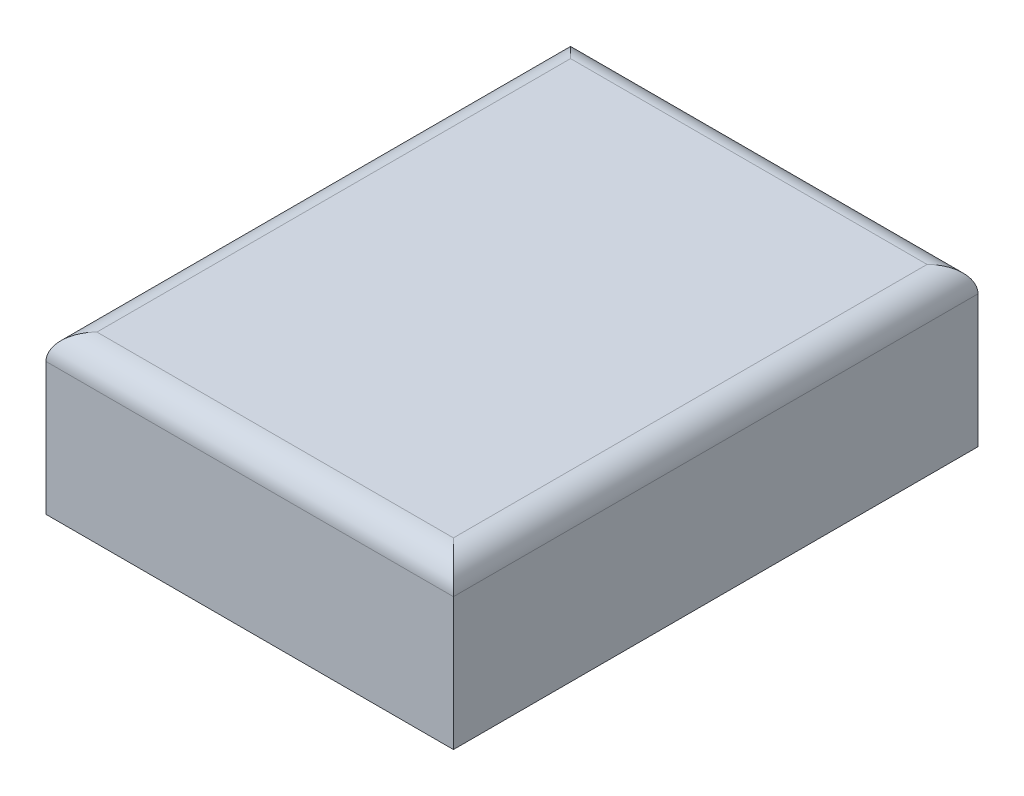
ISO-10303-21;
HEADER;
FILE_DESCRIPTION(('STEP AP214'),'2;1');
FILE_NAME('part.step','',(''),(''),'','','');
FILE_SCHEMA(('AUTOMOTIVE_DESIGN { 1 0 10303 214 1 1 1 1 }'));
ENDSEC;
DATA;
#1=APPLICATION_CONTEXT('core data for automotive mechanical design processes');
#2=APPLICATION_PROTOCOL_DEFINITION('international standard','automotive_design',2000,#1);
#3=PRODUCT_CONTEXT('',#1,'mechanical');
#4=PRODUCT('Part','Part','',(#3));
#5=PRODUCT_RELATED_PRODUCT_CATEGORY('part','',(#4));
#6=PRODUCT_DEFINITION_FORMATION('','',#4);
#7=PRODUCT_DEFINITION_CONTEXT('part definition',#1,'design');
#8=PRODUCT_DEFINITION('design','',#6,#7);
#9=PRODUCT_DEFINITION_SHAPE('','',#8);
#10=(LENGTH_UNIT() NAMED_UNIT(*) SI_UNIT(.MILLI.,.METRE.));
#11=(NAMED_UNIT(*) PLANE_ANGLE_UNIT() SI_UNIT($,.RADIAN.));
#12=(NAMED_UNIT(*) SI_UNIT($,.STERADIAN.) SOLID_ANGLE_UNIT());
#13=UNCERTAINTY_MEASURE_WITH_UNIT(LENGTH_MEASURE(1.E-05),#10,'distance_accuracy_value','');
#14=(GEOMETRIC_REPRESENTATION_CONTEXT(3) GLOBAL_UNCERTAINTY_ASSIGNED_CONTEXT((#13)) GLOBAL_UNIT_ASSIGNED_CONTEXT((#10,
#11,#12)) REPRESENTATION_CONTEXT('',''));
#15=CARTESIAN_POINT('',(0.,0.,0.));
#16=DIRECTION('',(0.,0.,1.));
#17=DIRECTION('',(1.,0.,0.));
#18=AXIS2_PLACEMENT_3D('',#15,#16,#17);
#19=CARTESIAN_POINT('',(0.8,0.62,-1.03));
#20=DIRECTION('',(-1.,0.,0.));
#21=DIRECTION('',(0.,0.,1.));
#22=AXIS2_PLACEMENT_3D('',#19,#20,#21);
#23=PLANE('',#22);
#24=DIRECTION('',(0.,-1.,0.));
#25=VECTOR('',#24,1.);
#26=CARTESIAN_POINT('',(0.8,0.62,-1.03));
#27=LINE('',#26,#25);
#28=CARTESIAN_POINT('',(0.8,0.52,-1.03));
#29=VERTEX_POINT('',#28);
#30=CARTESIAN_POINT('',(0.8,0.,-1.03));
#31=VERTEX_POINT('',#30);
#32=EDGE_CURVE('E92',#29,#31,#27,.T.);
#33=ORIENTED_EDGE('',*,*,#32,.F.);
#34=DIRECTION('',(0.,0.,-1.));
#35=VECTOR('',#34,1.);
#36=CARTESIAN_POINT('',(0.8,0.52,1.03));
#37=LINE('',#36,#35);
#38=CARTESIAN_POINT('',(0.8,0.52,1.03));
#39=VERTEX_POINT('',#38);
#40=EDGE_CURVE('E57',#29,#39,#37,.F.);
#41=ORIENTED_EDGE('',*,*,#40,.T.);
#42=DIRECTION('',(0.,-1.,0.));
#43=VECTOR('',#42,1.);
#44=CARTESIAN_POINT('',(0.8,0.62,1.03));
#45=LINE('',#44,#43);
#46=CARTESIAN_POINT('',(0.8,0.,1.03));
#47=VERTEX_POINT('',#46);
#48=EDGE_CURVE('E111',#39,#47,#45,.T.);
#49=ORIENTED_EDGE('',*,*,#48,.T.);
#50=DIRECTION('',(0.,0.,-1.));
#51=VECTOR('',#50,1.);
#52=CARTESIAN_POINT('',(0.8,0.,-1.03));
#53=LINE('',#52,#51);
#54=EDGE_CURVE('E106',#47,#31,#53,.T.);
#55=ORIENTED_EDGE('',*,*,#54,.T.);
#56=EDGE_LOOP('',(#33,#41,#49,#55));
#57=FACE_BOUND('',#56,.T.);
#58=ADVANCED_FACE('F39',(#57),#23,.F.);
#59=CARTESIAN_POINT('',(-0.8,0.62,-1.03));
#60=DIRECTION('',(0.,0.,1.));
#61=DIRECTION('',(1.,0.,0.));
#62=AXIS2_PLACEMENT_3D('',#59,#60,#61);
#63=PLANE('',#62);
#64=DIRECTION('',(0.,-1.,0.));
#65=VECTOR('',#64,1.);
#66=CARTESIAN_POINT('',(-0.8,0.62,-1.03));
#67=LINE('',#66,#65);
#68=CARTESIAN_POINT('',(-0.8,0.52,-1.03));
#69=VERTEX_POINT('',#68);
#70=CARTESIAN_POINT('',(-0.8,0.,-1.03));
#71=VERTEX_POINT('',#70);
#72=EDGE_CURVE('E100',#69,#71,#67,.T.);
#73=ORIENTED_EDGE('',*,*,#72,.F.);
#74=DIRECTION('',(-1.,0.,0.));
#75=VECTOR('',#74,1.);
#76=CARTESIAN_POINT('',(0.8,0.52,-1.03));
#77=LINE('',#76,#75);
#78=EDGE_CURVE('E49',#69,#29,#77,.F.);
#79=ORIENTED_EDGE('',*,*,#78,.T.);
#80=ORIENTED_EDGE('',*,*,#32,.T.);
#81=DIRECTION('',(-1.,0.,0.));
#82=VECTOR('',#81,1.);
#83=CARTESIAN_POINT('',(-0.8,0.,-1.03));
#84=LINE('',#83,#82);
#85=EDGE_CURVE('E95',#31,#71,#84,.T.);
#86=ORIENTED_EDGE('',*,*,#85,.T.);
#87=EDGE_LOOP('',(#73,#79,#80,#86));
#88=FACE_BOUND('',#87,.T.);
#89=ADVANCED_FACE('F94',(#88),#63,.F.);
#90=CARTESIAN_POINT('',(-0.8,0.62,-1.03));
#91=DIRECTION('',(1.,0.,0.));
#92=DIRECTION('',(0.,0.,-1.));
#93=AXIS2_PLACEMENT_3D('',#90,#91,#92);
#94=PLANE('',#93);
#95=DIRECTION('',(0.,-1.,0.));
#96=VECTOR('',#95,1.);
#97=CARTESIAN_POINT('',(-0.8,0.62,1.03));
#98=LINE('',#97,#96);
#99=CARTESIAN_POINT('',(-0.8,0.52,1.03));
#100=VERTEX_POINT('',#99);
#101=CARTESIAN_POINT('',(-0.8,0.,1.03));
#102=VERTEX_POINT('',#101);
#103=EDGE_CURVE('E126',#100,#102,#98,.T.);
#104=ORIENTED_EDGE('',*,*,#103,.F.);
#105=DIRECTION('',(0.,0.,1.));
#106=VECTOR('',#105,1.);
#107=CARTESIAN_POINT('',(-0.8,0.52,-1.03));
#108=LINE('',#107,#106);
#109=EDGE_CURVE('E143',#100,#69,#108,.F.);
#110=ORIENTED_EDGE('',*,*,#109,.T.);
#111=ORIENTED_EDGE('',*,*,#72,.T.);
#112=DIRECTION('',(0.,0.,1.));
#113=VECTOR('',#112,1.);
#114=CARTESIAN_POINT('',(-0.8,0.,-1.03));
#115=LINE('',#114,#113);
#116=EDGE_CURVE('E108',#71,#102,#115,.T.);
#117=ORIENTED_EDGE('',*,*,#116,.T.);
#118=EDGE_LOOP('',(#104,#110,#111,#117));
#119=FACE_BOUND('',#118,.T.);
#120=ADVANCED_FACE('F177',(#119),#94,.F.);
#121=CARTESIAN_POINT('',(-0.8,0.62,1.03));
#122=DIRECTION('',(0.,0.,-1.));
#123=DIRECTION('',(-1.,0.,0.));
#124=AXIS2_PLACEMENT_3D('',#121,#122,#123);
#125=PLANE('',#124);
#126=ORIENTED_EDGE('',*,*,#48,.F.);
#127=DIRECTION('',(1.,0.,0.));
#128=VECTOR('',#127,1.);
#129=CARTESIAN_POINT('',(-0.8,0.52,1.03));
#130=LINE('',#129,#128);
#131=EDGE_CURVE('E11',#39,#100,#130,.F.);
#132=ORIENTED_EDGE('',*,*,#131,.T.);
#133=ORIENTED_EDGE('',*,*,#103,.T.);
#134=DIRECTION('',(1.,0.,0.));
#135=VECTOR('',#134,1.);
#136=CARTESIAN_POINT('',(-0.8,0.,1.03));
#137=LINE('',#136,#135);
#138=EDGE_CURVE('E121',#102,#47,#137,.T.);
#139=ORIENTED_EDGE('',*,*,#138,.T.);
#140=EDGE_LOOP('',(#126,#132,#133,#139));
#141=FACE_BOUND('',#140,.T.);
#142=ADVANCED_FACE('F179',(#141),#125,.F.);
#143=CARTESIAN_POINT('',(0.,0.62,0.));
#144=DIRECTION('',(0.,1.,0.));
#145=DIRECTION('',(0.,0.,1.));
#146=AXIS2_PLACEMENT_3D('',#143,#144,#145);
#147=PLANE('',#146);
#148=DIRECTION('',(0.,0.,-1.));
#149=VECTOR('',#148,1.);
#150=CARTESIAN_POINT('',(0.7,0.62,-1.03));
#151=LINE('',#150,#149);
#152=CARTESIAN_POINT('',(0.7,0.62,0.93));
#153=VERTEX_POINT('',#152);
#154=CARTESIAN_POINT('',(0.7,0.62,-0.93));
#155=VERTEX_POINT('',#154);
#156=EDGE_CURVE('E133',#153,#155,#151,.T.);
#157=ORIENTED_EDGE('',*,*,#156,.T.);
#158=DIRECTION('',(-1.,0.,0.));
#159=VECTOR('',#158,1.);
#160=CARTESIAN_POINT('',(-0.8,0.62,-0.93));
#161=LINE('',#160,#159);
#162=CARTESIAN_POINT('',(-0.7,0.62,-0.93));
#163=VERTEX_POINT('',#162);
#164=EDGE_CURVE('E140',#155,#163,#161,.T.);
#165=ORIENTED_EDGE('',*,*,#164,.T.);
#166=DIRECTION('',(0.,0.,1.));
#167=VECTOR('',#166,1.);
#168=CARTESIAN_POINT('',(-0.7,0.62,1.03));
#169=LINE('',#168,#167);
#170=CARTESIAN_POINT('',(-0.7,0.62,0.93));
#171=VERTEX_POINT('',#170);
#172=EDGE_CURVE('E136',#163,#171,#169,.T.);
#173=ORIENTED_EDGE('',*,*,#172,.T.);
#174=DIRECTION('',(1.,0.,0.));
#175=VECTOR('',#174,1.);
#176=CARTESIAN_POINT('',(0.8,0.62,0.93));
#177=LINE('',#176,#175);
#178=EDGE_CURVE('E99',#171,#153,#177,.T.);
#179=ORIENTED_EDGE('',*,*,#178,.T.);
#180=EDGE_LOOP('',(#157,#165,#173,#179));
#181=FACE_BOUND('',#180,.T.);
#182=ADVANCED_FACE('F169',(#181),#147,.T.);
#183=CARTESIAN_POINT('',(0.,0.,0.));
#184=DIRECTION('',(0.,1.,0.));
#185=DIRECTION('',(0.,0.,1.));
#186=AXIS2_PLACEMENT_3D('',#183,#184,#185);
#187=PLANE('',#186);
#188=ORIENTED_EDGE('',*,*,#54,.F.);
#189=ORIENTED_EDGE('',*,*,#138,.F.);
#190=ORIENTED_EDGE('',*,*,#116,.F.);
#191=ORIENTED_EDGE('',*,*,#85,.F.);
#192=EDGE_LOOP('',(#188,#189,#190,#191));
#193=FACE_BOUND('',#192,.T.);
#194=ADVANCED_FACE('F104',(#193),#187,.F.);
#195=CARTESIAN_POINT('',(0.7,0.52,0.));
#196=DIRECTION('',(0.,0.,1.));
#197=DIRECTION('',(1.,0.,0.));
#198=AXIS2_PLACEMENT_3D('',#195,#196,#197);
#199=CYLINDRICAL_SURFACE('',#198,0.1);
#200=CARTESIAN_POINT('',(0.7,0.52,0.93));
#201=DIRECTION('',(-0.707106781186547,0.,0.707106781186548));
#202=DIRECTION('',(-0.707106781186548,0.,-0.707106781186547));
#203=AXIS2_PLACEMENT_3D('',#200,#201,#202);
#204=ELLIPSE('',#203,0.14142135623731,0.1);
#205=EDGE_CURVE('E117',#39,#153,#204,.T.);
#206=ORIENTED_EDGE('',*,*,#205,.F.);
#207=ORIENTED_EDGE('',*,*,#40,.F.);
#208=CARTESIAN_POINT('',(0.7,0.52,-0.93));
#209=DIRECTION('',(0.707106781186548,0.,0.707106781186547));
#210=DIRECTION('',(0.707106781186547,0.,-0.707106781186548));
#211=AXIS2_PLACEMENT_3D('',#208,#209,#210);
#212=ELLIPSE('',#211,0.14142135623731,0.1);
#213=EDGE_CURVE('E43',#155,#29,#212,.F.);
#214=ORIENTED_EDGE('',*,*,#213,.F.);
#215=ORIENTED_EDGE('',*,*,#156,.F.);
#216=EDGE_LOOP('',(#206,#207,#214,#215));
#217=FACE_BOUND('',#216,.T.);
#218=ADVANCED_FACE('F41',(#217),#199,.T.);
#219=CARTESIAN_POINT('',(0.,0.52,-0.93));
#220=DIRECTION('',(1.,0.,0.));
#221=DIRECTION('',(0.,0.,-1.));
#222=AXIS2_PLACEMENT_3D('',#219,#220,#221);
#223=CYLINDRICAL_SURFACE('',#222,0.1);
#224=ORIENTED_EDGE('',*,*,#213,.T.);
#225=ORIENTED_EDGE('',*,*,#78,.F.);
#226=CARTESIAN_POINT('',(-0.7,0.52,-0.93));
#227=DIRECTION('',(0.707106781186547,0.,-0.707106781186548));
#228=DIRECTION('',(0.707106781186548,0.,0.707106781186547));
#229=AXIS2_PLACEMENT_3D('',#226,#227,#228);
#230=ELLIPSE('',#229,0.14142135623731,0.1);
#231=EDGE_CURVE('E154',#163,#69,#230,.F.);
#232=ORIENTED_EDGE('',*,*,#231,.F.);
#233=ORIENTED_EDGE('',*,*,#164,.F.);
#234=EDGE_LOOP('',(#224,#225,#232,#233));
#235=FACE_BOUND('',#234,.T.);
#236=ADVANCED_FACE('F199',(#235),#223,.T.);
#237=CARTESIAN_POINT('',(0.,0.52,0.93));
#238=DIRECTION('',(-1.,0.,0.));
#239=DIRECTION('',(0.,0.,1.));
#240=AXIS2_PLACEMENT_3D('',#237,#238,#239);
#241=CYLINDRICAL_SURFACE('',#240,0.1);
#242=ORIENTED_EDGE('',*,*,#205,.T.);
#243=ORIENTED_EDGE('',*,*,#178,.F.);
#244=CARTESIAN_POINT('',(-0.7,0.52,0.93));
#245=DIRECTION('',(-0.707106781186548,0.,-0.707106781186547));
#246=DIRECTION('',(-0.707106781186547,0.,0.707106781186548));
#247=AXIS2_PLACEMENT_3D('',#244,#245,#246);
#248=ELLIPSE('',#247,0.14142135623731,0.1);
#249=EDGE_CURVE('E151',#100,#171,#248,.T.);
#250=ORIENTED_EDGE('',*,*,#249,.F.);
#251=ORIENTED_EDGE('',*,*,#131,.F.);
#252=EDGE_LOOP('',(#242,#243,#250,#251));
#253=FACE_BOUND('',#252,.T.);
#254=ADVANCED_FACE('F162',(#253),#241,.T.);
#255=CARTESIAN_POINT('',(-0.7,0.52,0.));
#256=DIRECTION('',(0.,0.,-1.));
#257=DIRECTION('',(-1.,0.,0.));
#258=AXIS2_PLACEMENT_3D('',#255,#256,#257);
#259=CYLINDRICAL_SURFACE('',#258,0.1);
#260=ORIENTED_EDGE('',*,*,#231,.T.);
#261=ORIENTED_EDGE('',*,*,#109,.F.);
#262=ORIENTED_EDGE('',*,*,#249,.T.);
#263=ORIENTED_EDGE('',*,*,#172,.F.);
#264=EDGE_LOOP('',(#260,#261,#262,#263));
#265=FACE_BOUND('',#264,.T.);
#266=ADVANCED_FACE('F173',(#265),#259,.T.);
#267=CLOSED_SHELL('',(#58,#89,#120,#142,#182,#194,#218,#236,#254,#266));
#268=MANIFOLD_SOLID_BREP('B2',#267);
#269=ADVANCED_BREP_SHAPE_REPRESENTATION('',(#18,#268),#14);
#270=SHAPE_DEFINITION_REPRESENTATION(#9,#269);
ENDSEC;
END-ISO-10303-21;
